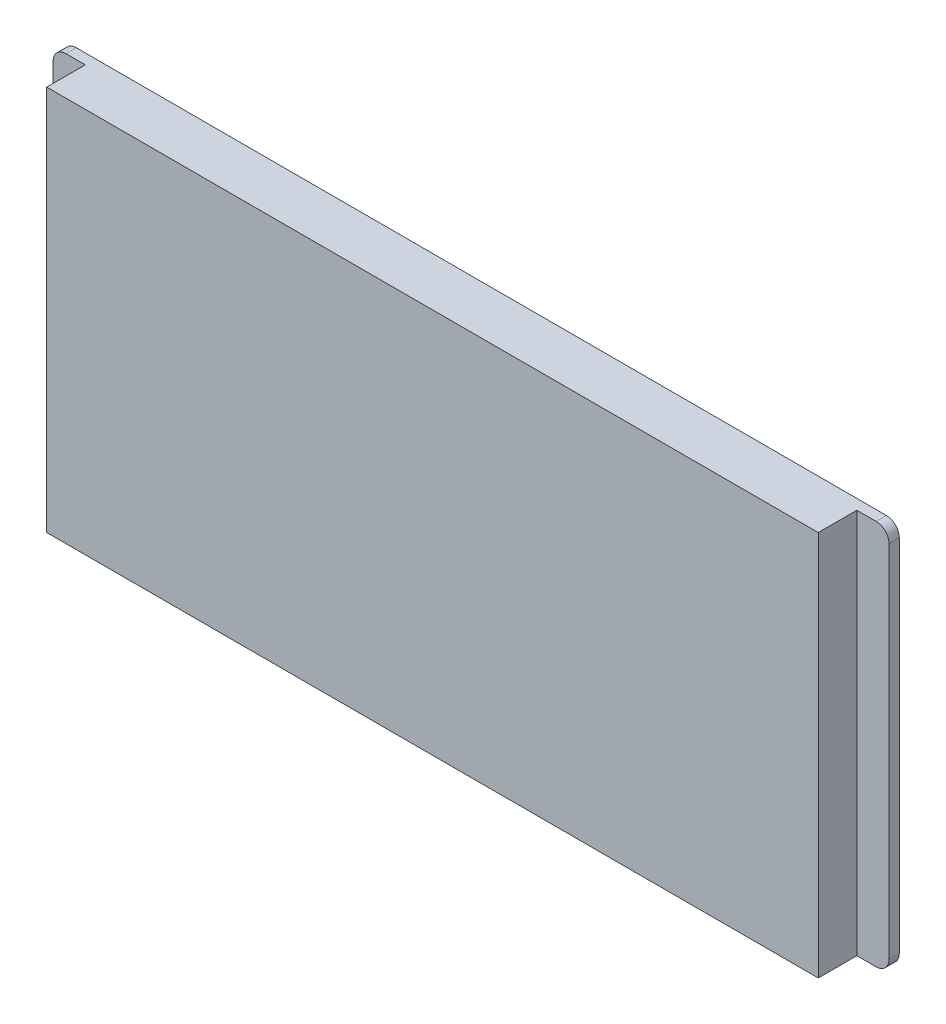
ISO-10303-21;
HEADER;
FILE_DESCRIPTION(('STEP AP214'),'2;1');
FILE_NAME('part.step','',(''),(''),'','','');
FILE_SCHEMA(('AUTOMOTIVE_DESIGN { 1 0 10303 214 1 1 1 1 }'));
ENDSEC;
DATA;
#1=APPLICATION_CONTEXT('core data for automotive mechanical design processes');
#2=APPLICATION_PROTOCOL_DEFINITION('international standard','automotive_design',2000,#1);
#3=PRODUCT_CONTEXT('',#1,'mechanical');
#4=PRODUCT('Part','Part','',(#3));
#5=PRODUCT_RELATED_PRODUCT_CATEGORY('part','',(#4));
#6=PRODUCT_DEFINITION_FORMATION('','',#4);
#7=PRODUCT_DEFINITION_CONTEXT('part definition',#1,'design');
#8=PRODUCT_DEFINITION('design','',#6,#7);
#9=PRODUCT_DEFINITION_SHAPE('','',#8);
#10=(LENGTH_UNIT() NAMED_UNIT(*) SI_UNIT(.MILLI.,.METRE.));
#11=(NAMED_UNIT(*) PLANE_ANGLE_UNIT() SI_UNIT($,.RADIAN.));
#12=(NAMED_UNIT(*) SI_UNIT($,.STERADIAN.) SOLID_ANGLE_UNIT());
#13=UNCERTAINTY_MEASURE_WITH_UNIT(LENGTH_MEASURE(1.E-05),#10,'distance_accuracy_value','');
#14=(GEOMETRIC_REPRESENTATION_CONTEXT(3) GLOBAL_UNCERTAINTY_ASSIGNED_CONTEXT((#13)) GLOBAL_UNIT_ASSIGNED_CONTEXT((#10,
#11,#12)) REPRESENTATION_CONTEXT('',''));
#15=CARTESIAN_POINT('',(0.,0.,0.));
#16=DIRECTION('',(0.,0.,1.));
#17=DIRECTION('',(1.,0.,0.));
#18=AXIS2_PLACEMENT_3D('',#15,#16,#17);
#19=CARTESIAN_POINT('',(-60.,-30.,7.6));
#20=DIRECTION('',(1.,0.,0.));
#21=DIRECTION('',(0.,0.,-1.));
#22=AXIS2_PLACEMENT_3D('',#19,#20,#21);
#23=PLANE('',#22);
#24=DIRECTION('',(0.,1.,0.));
#25=VECTOR('',#24,1.);
#26=CARTESIAN_POINT('',(-60.,-30.,1.6));
#27=LINE('',#26,#25);
#28=CARTESIAN_POINT('',(-60.,-30.,1.6));
#29=VERTEX_POINT('',#28);
#30=CARTESIAN_POINT('',(-60.,30.,1.6));
#31=VERTEX_POINT('',#30);
#32=EDGE_CURVE('E147',#29,#31,#27,.T.);
#33=ORIENTED_EDGE('',*,*,#32,.F.);
#34=DIRECTION('',(0.,0.,-1.));
#35=VECTOR('',#34,1.);
#36=CARTESIAN_POINT('',(-60.,-30.,7.6));
#37=LINE('',#36,#35);
#38=CARTESIAN_POINT('',(-60.,-30.,7.6));
#39=VERTEX_POINT('',#38);
#40=EDGE_CURVE('E128',#39,#29,#37,.T.);
#41=ORIENTED_EDGE('',*,*,#40,.F.);
#42=DIRECTION('',(0.,-1.,0.));
#43=VECTOR('',#42,1.);
#44=CARTESIAN_POINT('',(-60.,-30.,7.6));
#45=LINE('',#44,#43);
#46=CARTESIAN_POINT('',(-60.,30.,7.6));
#47=VERTEX_POINT('',#46);
#48=EDGE_CURVE('E135',#47,#39,#45,.T.);
#49=ORIENTED_EDGE('',*,*,#48,.F.);
#50=DIRECTION('',(0.,0.,-1.));
#51=VECTOR('',#50,1.);
#52=CARTESIAN_POINT('',(-60.,30.,7.6));
#53=LINE('',#52,#51);
#54=EDGE_CURVE('E219',#47,#31,#53,.T.);
#55=ORIENTED_EDGE('',*,*,#54,.T.);
#56=EDGE_LOOP('',(#33,#41,#49,#55));
#57=FACE_BOUND('',#56,.T.);
#58=ADVANCED_FACE('F34',(#57),#23,.F.);
#59=CARTESIAN_POINT('',(60.,-30.,7.6));
#60=DIRECTION('',(-1.,0.,0.));
#61=DIRECTION('',(0.,0.,1.));
#62=AXIS2_PLACEMENT_3D('',#59,#60,#61);
#63=PLANE('',#62);
#64=DIRECTION('',(0.,-1.,0.));
#65=VECTOR('',#64,1.);
#66=CARTESIAN_POINT('',(60.,-30.,1.6));
#67=LINE('',#66,#65);
#68=CARTESIAN_POINT('',(60.,30.,1.6));
#69=VERTEX_POINT('',#68);
#70=CARTESIAN_POINT('',(60.,-30.,1.6));
#71=VERTEX_POINT('',#70);
#72=EDGE_CURVE('E213',#69,#71,#67,.T.);
#73=ORIENTED_EDGE('',*,*,#72,.F.);
#74=DIRECTION('',(0.,0.,-1.));
#75=VECTOR('',#74,1.);
#76=CARTESIAN_POINT('',(60.,30.,7.6));
#77=LINE('',#76,#75);
#78=CARTESIAN_POINT('',(60.,30.,7.6));
#79=VERTEX_POINT('',#78);
#80=EDGE_CURVE('E152',#79,#69,#77,.T.);
#81=ORIENTED_EDGE('',*,*,#80,.F.);
#82=DIRECTION('',(0.,1.,0.));
#83=VECTOR('',#82,1.);
#84=CARTESIAN_POINT('',(60.,-30.,7.6));
#85=LINE('',#84,#83);
#86=CARTESIAN_POINT('',(60.,-30.,7.6));
#87=VERTEX_POINT('',#86);
#88=EDGE_CURVE('E134',#87,#79,#85,.T.);
#89=ORIENTED_EDGE('',*,*,#88,.F.);
#90=DIRECTION('',(0.,0.,-1.));
#91=VECTOR('',#90,1.);
#92=CARTESIAN_POINT('',(60.,-30.,7.6));
#93=LINE('',#92,#91);
#94=EDGE_CURVE('E131',#87,#71,#93,.T.);
#95=ORIENTED_EDGE('',*,*,#94,.T.);
#96=EDGE_LOOP('',(#73,#81,#89,#95));
#97=FACE_BOUND('',#96,.T.);
#98=ADVANCED_FACE('F250',(#97),#63,.F.);
#99=CARTESIAN_POINT('',(60.,-30.,7.6));
#100=DIRECTION('',(0.,1.,0.));
#101=DIRECTION('',(-1.,0.,0.));
#102=AXIS2_PLACEMENT_3D('',#99,#100,#101);
#103=PLANE('',#102);
#104=DIRECTION('',(-1.,0.,0.));
#105=VECTOR('',#104,1.);
#106=CARTESIAN_POINT('',(-65.,-30.,1.6));
#107=LINE('',#106,#105);
#108=CARTESIAN_POINT('',(-63.,-30.,1.6));
#109=VERTEX_POINT('',#108);
#110=EDGE_CURVE('E227',#29,#109,#107,.T.);
#111=ORIENTED_EDGE('',*,*,#110,.T.);
#112=DIRECTION('',(0.,0.,-1.));
#113=VECTOR('',#112,1.);
#114=CARTESIAN_POINT('',(-63.,-30.,0.));
#115=LINE('',#114,#113);
#116=CARTESIAN_POINT('',(-63.,-30.,0.));
#117=VERTEX_POINT('',#116);
#118=EDGE_CURVE('E177',#109,#117,#115,.T.);
#119=ORIENTED_EDGE('',*,*,#118,.T.);
#120=DIRECTION('',(1.,0.,0.));
#121=VECTOR('',#120,1.);
#122=CARTESIAN_POINT('',(60.,-30.,0.));
#123=LINE('',#122,#121);
#124=CARTESIAN_POINT('',(63.,-30.,0.));
#125=VERTEX_POINT('',#124);
#126=EDGE_CURVE('E215',#117,#125,#123,.T.);
#127=ORIENTED_EDGE('',*,*,#126,.T.);
#128=DIRECTION('',(0.,0.,-1.));
#129=VECTOR('',#128,1.);
#130=CARTESIAN_POINT('',(63.,-30.,1.6));
#131=LINE('',#130,#129);
#132=CARTESIAN_POINT('',(63.,-30.,1.6));
#133=VERTEX_POINT('',#132);
#134=EDGE_CURVE('E175',#125,#133,#131,.F.);
#135=ORIENTED_EDGE('',*,*,#134,.T.);
#136=EDGE_CURVE('E231',#133,#71,#107,.T.);
#137=ORIENTED_EDGE('',*,*,#136,.T.);
#138=ORIENTED_EDGE('',*,*,#94,.F.);
#139=DIRECTION('',(1.,0.,0.));
#140=VECTOR('',#139,1.);
#141=CARTESIAN_POINT('',(60.,-30.,7.6));
#142=LINE('',#141,#140);
#143=EDGE_CURVE('E123',#39,#87,#142,.T.);
#144=ORIENTED_EDGE('',*,*,#143,.F.);
#145=ORIENTED_EDGE('',*,*,#40,.T.);
#146=EDGE_LOOP('',(#111,#119,#127,#135,#137,#138,#144,#145));
#147=FACE_BOUND('',#146,.T.);
#148=ADVANCED_FACE('F126',(#147),#103,.F.);
#149=CARTESIAN_POINT('',(60.,30.,7.6));
#150=DIRECTION('',(0.,-1.,0.));
#151=DIRECTION('',(1.,0.,0.));
#152=AXIS2_PLACEMENT_3D('',#149,#150,#151);
#153=PLANE('',#152);
#154=DIRECTION('',(-1.,0.,0.));
#155=VECTOR('',#154,1.);
#156=CARTESIAN_POINT('',(60.,30.,0.));
#157=LINE('',#156,#155);
#158=CARTESIAN_POINT('',(63.,30.,0.));
#159=VERTEX_POINT('',#158);
#160=CARTESIAN_POINT('',(-63.,30.,0.));
#161=VERTEX_POINT('',#160);
#162=EDGE_CURVE('E144',#159,#161,#157,.T.);
#163=ORIENTED_EDGE('',*,*,#162,.T.);
#164=DIRECTION('',(0.,0.,-1.));
#165=VECTOR('',#164,1.);
#166=CARTESIAN_POINT('',(-63.,30.,1.6));
#167=LINE('',#166,#165);
#168=CARTESIAN_POINT('',(-63.,30.,1.6));
#169=VERTEX_POINT('',#168);
#170=EDGE_CURVE('E169',#161,#169,#167,.F.);
#171=ORIENTED_EDGE('',*,*,#170,.T.);
#172=DIRECTION('',(1.,0.,0.));
#173=VECTOR('',#172,1.);
#174=CARTESIAN_POINT('',(-65.,30.,1.6));
#175=LINE('',#174,#173);
#176=EDGE_CURVE('E198',#169,#31,#175,.T.);
#177=ORIENTED_EDGE('',*,*,#176,.T.);
#178=ORIENTED_EDGE('',*,*,#54,.F.);
#179=DIRECTION('',(-1.,0.,0.));
#180=VECTOR('',#179,1.);
#181=CARTESIAN_POINT('',(60.,30.,7.6));
#182=LINE('',#181,#180);
#183=EDGE_CURVE('E140',#79,#47,#182,.T.);
#184=ORIENTED_EDGE('',*,*,#183,.F.);
#185=ORIENTED_EDGE('',*,*,#80,.T.);
#186=CARTESIAN_POINT('',(63.,30.,1.6));
#187=VERTEX_POINT('',#186);
#188=EDGE_CURVE('E188',#69,#187,#175,.T.);
#189=ORIENTED_EDGE('',*,*,#188,.T.);
#190=DIRECTION('',(0.,0.,-1.));
#191=VECTOR('',#190,1.);
#192=CARTESIAN_POINT('',(63.,30.,0.));
#193=LINE('',#192,#191);
#194=EDGE_CURVE('E166',#187,#159,#193,.T.);
#195=ORIENTED_EDGE('',*,*,#194,.T.);
#196=EDGE_LOOP('',(#163,#171,#177,#178,#184,#185,#189,#195));
#197=FACE_BOUND('',#196,.T.);
#198=ADVANCED_FACE('F195',(#197),#153,.F.);
#199=CARTESIAN_POINT('',(0.,0.,7.6));
#200=DIRECTION('',(0.,0.,1.));
#201=DIRECTION('',(1.,0.,0.));
#202=AXIS2_PLACEMENT_3D('',#199,#200,#201);
#203=PLANE('',#202);
#204=ORIENTED_EDGE('',*,*,#48,.T.);
#205=ORIENTED_EDGE('',*,*,#143,.T.);
#206=ORIENTED_EDGE('',*,*,#88,.T.);
#207=ORIENTED_EDGE('',*,*,#183,.T.);
#208=EDGE_LOOP('',(#204,#205,#206,#207));
#209=FACE_BOUND('',#208,.T.);
#210=ADVANCED_FACE('F138',(#209),#203,.T.);
#211=CARTESIAN_POINT('',(0.,0.,0.));
#212=DIRECTION('',(0.,0.,1.));
#213=DIRECTION('',(1.,0.,0.));
#214=AXIS2_PLACEMENT_3D('',#211,#212,#213);
#215=PLANE('',#214);
#216=DIRECTION('',(0.,1.,0.));
#217=VECTOR('',#216,1.);
#218=CARTESIAN_POINT('',(-65.,-30.,0.));
#219=LINE('',#218,#217);
#220=CARTESIAN_POINT('',(-65.,-28.,0.));
#221=VERTEX_POINT('',#220);
#222=CARTESIAN_POINT('',(-65.,28.,0.));
#223=VERTEX_POINT('',#222);
#224=EDGE_CURVE('E208',#221,#223,#219,.T.);
#225=ORIENTED_EDGE('',*,*,#224,.T.);
#226=CARTESIAN_POINT('',(-63.,28.,0.));
#227=DIRECTION('',(0.,0.,1.));
#228=DIRECTION('',(1.,0.,0.));
#229=AXIS2_PLACEMENT_3D('',#226,#227,#228);
#230=CIRCLE('',#229,2.);
#231=EDGE_CURVE('E164',#223,#161,#230,.F.);
#232=ORIENTED_EDGE('',*,*,#231,.T.);
#233=ORIENTED_EDGE('',*,*,#162,.F.);
#234=CARTESIAN_POINT('',(63.,28.,0.));
#235=DIRECTION('',(0.,0.,1.));
#236=DIRECTION('',(1.,0.,0.));
#237=AXIS2_PLACEMENT_3D('',#234,#235,#236);
#238=CIRCLE('',#237,2.);
#239=CARTESIAN_POINT('',(65.,28.,0.));
#240=VERTEX_POINT('',#239);
#241=EDGE_CURVE('E158',#159,#240,#238,.F.);
#242=ORIENTED_EDGE('',*,*,#241,.T.);
#243=DIRECTION('',(0.,-1.,0.));
#244=VECTOR('',#243,1.);
#245=CARTESIAN_POINT('',(65.,-30.,0.));
#246=LINE('',#245,#244);
#247=CARTESIAN_POINT('',(65.,-28.,0.));
#248=VERTEX_POINT('',#247);
#249=EDGE_CURVE('E205',#240,#248,#246,.T.);
#250=ORIENTED_EDGE('',*,*,#249,.T.);
#251=CARTESIAN_POINT('',(63.,-28.,0.));
#252=DIRECTION('',(0.,0.,1.));
#253=DIRECTION('',(1.,0.,0.));
#254=AXIS2_PLACEMENT_3D('',#251,#252,#253);
#255=CIRCLE('',#254,2.);
#256=EDGE_CURVE('E160',#248,#125,#255,.F.);
#257=ORIENTED_EDGE('',*,*,#256,.T.);
#258=ORIENTED_EDGE('',*,*,#126,.F.);
#259=CARTESIAN_POINT('',(-63.,-28.,0.));
#260=DIRECTION('',(0.,0.,1.));
#261=DIRECTION('',(1.,0.,0.));
#262=AXIS2_PLACEMENT_3D('',#259,#260,#261);
#263=CIRCLE('',#262,2.);
#264=EDGE_CURVE('E162',#117,#221,#263,.F.);
#265=ORIENTED_EDGE('',*,*,#264,.T.);
#266=EDGE_LOOP('',(#225,#232,#233,#242,#250,#257,#258,#265));
#267=FACE_BOUND('',#266,.T.);
#268=ADVANCED_FACE('F204',(#267),#215,.F.);
#269=CARTESIAN_POINT('',(65.,-30.,1.6));
#270=DIRECTION('',(1.,0.,0.));
#271=DIRECTION('',(0.,0.,-1.));
#272=AXIS2_PLACEMENT_3D('',#269,#270,#271);
#273=PLANE('',#272);
#274=DIRECTION('',(0.,-1.,0.));
#275=VECTOR('',#274,1.);
#276=CARTESIAN_POINT('',(65.,-30.,1.6));
#277=LINE('',#276,#275);
#278=CARTESIAN_POINT('',(65.,28.,1.6));
#279=VERTEX_POINT('',#278);
#280=CARTESIAN_POINT('',(65.,-28.,1.6));
#281=VERTEX_POINT('',#280);
#282=EDGE_CURVE('E189',#279,#281,#277,.T.);
#283=ORIENTED_EDGE('',*,*,#282,.T.);
#284=DIRECTION('',(0.,0.,-1.));
#285=VECTOR('',#284,1.);
#286=CARTESIAN_POINT('',(65.,-28.,0.));
#287=LINE('',#286,#285);
#288=EDGE_CURVE('E181',#281,#248,#287,.T.);
#289=ORIENTED_EDGE('',*,*,#288,.T.);
#290=ORIENTED_EDGE('',*,*,#249,.F.);
#291=DIRECTION('',(0.,0.,-1.));
#292=VECTOR('',#291,1.);
#293=CARTESIAN_POINT('',(65.,28.,1.6));
#294=LINE('',#293,#292);
#295=EDGE_CURVE('E54',#240,#279,#294,.F.);
#296=ORIENTED_EDGE('',*,*,#295,.T.);
#297=EDGE_LOOP('',(#283,#289,#290,#296));
#298=FACE_BOUND('',#297,.T.);
#299=ADVANCED_FACE('F206',(#298),#273,.T.);
#300=CARTESIAN_POINT('',(0.,0.,1.6));
#301=DIRECTION('',(0.,0.,-1.));
#302=DIRECTION('',(-1.,0.,0.));
#303=AXIS2_PLACEMENT_3D('',#300,#301,#302);
#304=PLANE('',#303);
#305=ORIENTED_EDGE('',*,*,#136,.F.);
#306=CARTESIAN_POINT('',(63.,-28.,1.6));
#307=DIRECTION('',(0.,0.,-1.));
#308=DIRECTION('',(-1.,0.,0.));
#309=AXIS2_PLACEMENT_3D('',#306,#307,#308);
#310=CIRCLE('',#309,2.);
#311=EDGE_CURVE('E11',#133,#281,#310,.F.);
#312=ORIENTED_EDGE('',*,*,#311,.T.);
#313=ORIENTED_EDGE('',*,*,#282,.F.);
#314=CARTESIAN_POINT('',(63.,28.,1.6));
#315=DIRECTION('',(0.,0.,-1.));
#316=DIRECTION('',(-1.,0.,0.));
#317=AXIS2_PLACEMENT_3D('',#314,#315,#316);
#318=CIRCLE('',#317,2.);
#319=EDGE_CURVE('E42',#279,#187,#318,.F.);
#320=ORIENTED_EDGE('',*,*,#319,.T.);
#321=ORIENTED_EDGE('',*,*,#188,.F.);
#322=ORIENTED_EDGE('',*,*,#72,.T.);
#323=EDGE_LOOP('',(#305,#312,#313,#320,#321,#322));
#324=FACE_BOUND('',#323,.T.);
#325=ADVANCED_FACE('F186',(#324),#304,.F.);
#326=ORIENTED_EDGE('',*,*,#176,.F.);
#327=CARTESIAN_POINT('',(-63.,28.,1.6));
#328=DIRECTION('',(0.,0.,-1.));
#329=DIRECTION('',(-1.,0.,0.));
#330=AXIS2_PLACEMENT_3D('',#327,#328,#329);
#331=CIRCLE('',#330,2.);
#332=CARTESIAN_POINT('',(-65.,28.,1.6));
#333=VERTEX_POINT('',#332);
#334=EDGE_CURVE('E173',#169,#333,#331,.F.);
#335=ORIENTED_EDGE('',*,*,#334,.T.);
#336=DIRECTION('',(0.,1.,0.));
#337=VECTOR('',#336,1.);
#338=CARTESIAN_POINT('',(-65.,-30.,1.6));
#339=LINE('',#338,#337);
#340=CARTESIAN_POINT('',(-65.,-28.,1.6));
#341=VERTEX_POINT('',#340);
#342=EDGE_CURVE('E199',#341,#333,#339,.T.);
#343=ORIENTED_EDGE('',*,*,#342,.F.);
#344=CARTESIAN_POINT('',(-63.,-28.,1.6));
#345=DIRECTION('',(0.,0.,-1.));
#346=DIRECTION('',(-1.,0.,0.));
#347=AXIS2_PLACEMENT_3D('',#344,#345,#346);
#348=CIRCLE('',#347,2.);
#349=EDGE_CURVE('E171',#341,#109,#348,.F.);
#350=ORIENTED_EDGE('',*,*,#349,.T.);
#351=ORIENTED_EDGE('',*,*,#110,.F.);
#352=ORIENTED_EDGE('',*,*,#32,.T.);
#353=EDGE_LOOP('',(#326,#335,#343,#350,#351,#352));
#354=FACE_BOUND('',#353,.T.);
#355=ADVANCED_FACE('F225',(#354),#304,.F.);
#356=CARTESIAN_POINT('',(-65.,-30.,1.6));
#357=DIRECTION('',(-1.,0.,0.));
#358=DIRECTION('',(0.,0.,1.));
#359=AXIS2_PLACEMENT_3D('',#356,#357,#358);
#360=PLANE('',#359);
#361=ORIENTED_EDGE('',*,*,#342,.T.);
#362=DIRECTION('',(0.,0.,-1.));
#363=VECTOR('',#362,1.);
#364=CARTESIAN_POINT('',(-65.,28.,0.));
#365=LINE('',#364,#363);
#366=EDGE_CURVE('E150',#333,#223,#365,.T.);
#367=ORIENTED_EDGE('',*,*,#366,.T.);
#368=ORIENTED_EDGE('',*,*,#224,.F.);
#369=DIRECTION('',(0.,0.,-1.));
#370=VECTOR('',#369,1.);
#371=CARTESIAN_POINT('',(-65.,-28.,1.6));
#372=LINE('',#371,#370);
#373=EDGE_CURVE('E148',#221,#341,#372,.F.);
#374=ORIENTED_EDGE('',*,*,#373,.T.);
#375=EDGE_LOOP('',(#361,#367,#368,#374));
#376=FACE_BOUND('',#375,.T.);
#377=ADVANCED_FACE('F237',(#376),#360,.T.);
#378=CARTESIAN_POINT('',(-63.,28.,1.6));
#379=DIRECTION('',(0.,0.,1.));
#380=DIRECTION('',(1.,0.,0.));
#381=AXIS2_PLACEMENT_3D('',#378,#379,#380);
#382=CYLINDRICAL_SURFACE('',#381,2.);
#383=ORIENTED_EDGE('',*,*,#334,.F.);
#384=ORIENTED_EDGE('',*,*,#170,.F.);
#385=ORIENTED_EDGE('',*,*,#231,.F.);
#386=ORIENTED_EDGE('',*,*,#366,.F.);
#387=EDGE_LOOP('',(#383,#384,#385,#386));
#388=FACE_BOUND('',#387,.T.);
#389=ADVANCED_FACE('F241',(#388),#382,.T.);
#390=CARTESIAN_POINT('',(-63.,-28.,7.6));
#391=DIRECTION('',(0.,0.,1.));
#392=DIRECTION('',(1.,0.,0.));
#393=AXIS2_PLACEMENT_3D('',#390,#391,#392);
#394=CYLINDRICAL_SURFACE('',#393,2.);
#395=ORIENTED_EDGE('',*,*,#349,.F.);
#396=ORIENTED_EDGE('',*,*,#373,.F.);
#397=ORIENTED_EDGE('',*,*,#264,.F.);
#398=ORIENTED_EDGE('',*,*,#118,.F.);
#399=EDGE_LOOP('',(#395,#396,#397,#398));
#400=FACE_BOUND('',#399,.T.);
#401=ADVANCED_FACE('F245',(#400),#394,.T.);
#402=CARTESIAN_POINT('',(63.,-28.,1.6));
#403=DIRECTION('',(0.,0.,1.));
#404=DIRECTION('',(1.,0.,0.));
#405=AXIS2_PLACEMENT_3D('',#402,#403,#404);
#406=CYLINDRICAL_SURFACE('',#405,2.);
#407=ORIENTED_EDGE('',*,*,#311,.F.);
#408=ORIENTED_EDGE('',*,*,#134,.F.);
#409=ORIENTED_EDGE('',*,*,#256,.F.);
#410=ORIENTED_EDGE('',*,*,#288,.F.);
#411=EDGE_LOOP('',(#407,#408,#409,#410));
#412=FACE_BOUND('',#411,.T.);
#413=ADVANCED_FACE('F248',(#412),#406,.T.);
#414=CARTESIAN_POINT('',(63.,28.,7.6));
#415=DIRECTION('',(0.,0.,1.));
#416=DIRECTION('',(1.,0.,0.));
#417=AXIS2_PLACEMENT_3D('',#414,#415,#416);
#418=CYLINDRICAL_SURFACE('',#417,2.);
#419=ORIENTED_EDGE('',*,*,#319,.F.);
#420=ORIENTED_EDGE('',*,*,#295,.F.);
#421=ORIENTED_EDGE('',*,*,#241,.F.);
#422=ORIENTED_EDGE('',*,*,#194,.F.);
#423=EDGE_LOOP('',(#419,#420,#421,#422));
#424=FACE_BOUND('',#423,.T.);
#425=ADVANCED_FACE('F36',(#424),#418,.T.);
#426=CLOSED_SHELL('',(#58,#98,#148,#198,#210,#268,#299,#325,#355,#377,#389,#401,#413,#425));
#427=MANIFOLD_SOLID_BREP('B2',#426);
#428=ADVANCED_BREP_SHAPE_REPRESENTATION('',(#18,#427),#14);
#429=SHAPE_DEFINITION_REPRESENTATION(#9,#428);
ENDSEC;
END-ISO-10303-21;
